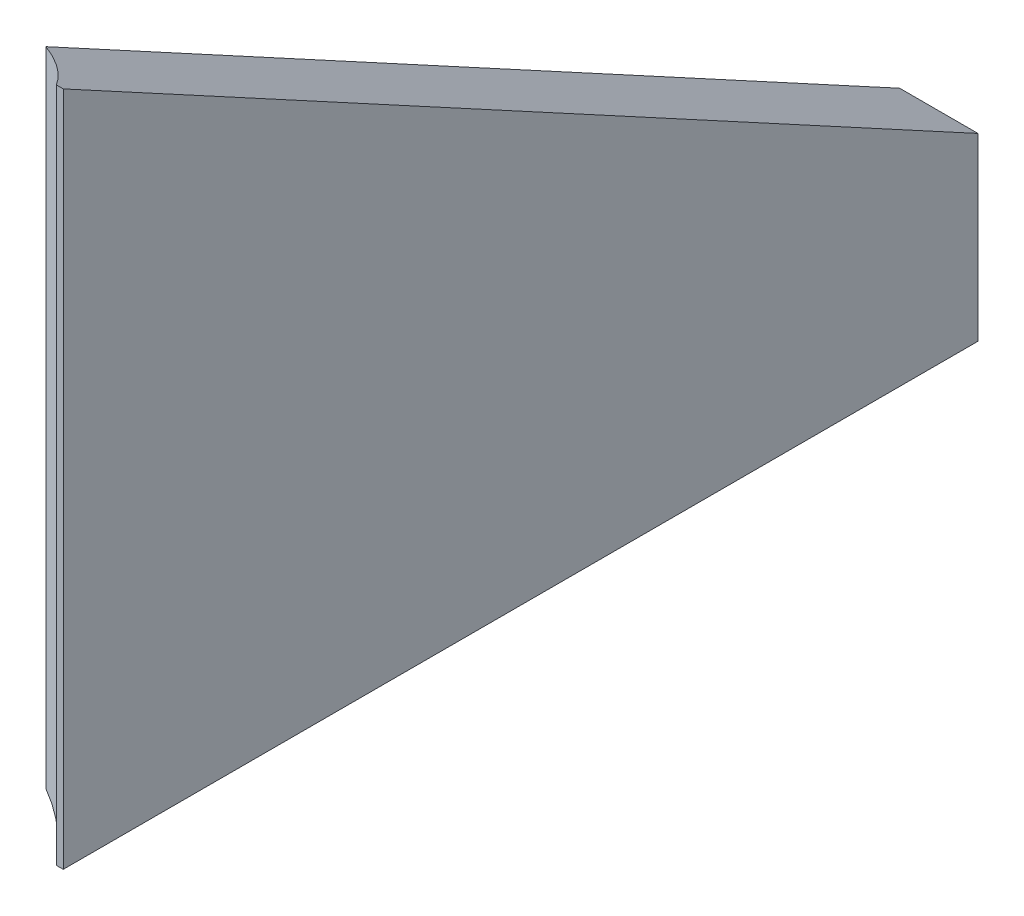
ISO-10303-21;
HEADER;
FILE_DESCRIPTION(('STEP AP214'),'2;1');
FILE_NAME('part.step','',(''),(''),'','','');
FILE_SCHEMA(('AUTOMOTIVE_DESIGN { 1 0 10303 214 1 1 1 1 }'));
ENDSEC;
DATA;
#1=APPLICATION_CONTEXT('core data for automotive mechanical design processes');
#2=APPLICATION_PROTOCOL_DEFINITION('international standard','automotive_design',2000,#1);
#3=PRODUCT_CONTEXT('',#1,'mechanical');
#4=PRODUCT('Part','Part','',(#3));
#5=PRODUCT_RELATED_PRODUCT_CATEGORY('part','',(#4));
#6=PRODUCT_DEFINITION_FORMATION('','',#4);
#7=PRODUCT_DEFINITION_CONTEXT('part definition',#1,'design');
#8=PRODUCT_DEFINITION('design','',#6,#7);
#9=PRODUCT_DEFINITION_SHAPE('','',#8);
#10=(LENGTH_UNIT() NAMED_UNIT(*) SI_UNIT(.MILLI.,.METRE.));
#11=(NAMED_UNIT(*) PLANE_ANGLE_UNIT() SI_UNIT($,.RADIAN.));
#12=(NAMED_UNIT(*) SI_UNIT($,.STERADIAN.) SOLID_ANGLE_UNIT());
#13=UNCERTAINTY_MEASURE_WITH_UNIT(LENGTH_MEASURE(1.E-05),#10,'distance_accuracy_value','');
#14=(GEOMETRIC_REPRESENTATION_CONTEXT(3) GLOBAL_UNCERTAINTY_ASSIGNED_CONTEXT((#13)) GLOBAL_UNIT_ASSIGNED_CONTEXT((#10,
#11,#12)) REPRESENTATION_CONTEXT('',''));
#15=CARTESIAN_POINT('',(0.,0.,0.));
#16=DIRECTION('',(0.,0.,1.));
#17=DIRECTION('',(1.,0.,0.));
#18=AXIS2_PLACEMENT_3D('',#15,#16,#17);
#19=CARTESIAN_POINT('',(3.77,0.,0.));
#20=DIRECTION('',(0.,0.,-1.));
#21=DIRECTION('',(-1.,0.,0.));
#22=AXIS2_PLACEMENT_3D('',#19,#20,#21);
#23=PLANE('',#22);
#24=DIRECTION('',(0.,1.,0.));
#25=VECTOR('',#24,1.);
#26=CARTESIAN_POINT('',(3.43406676279268,-0.0513372813892973,0.));
#27=LINE('',#26,#25);
#28=CARTESIAN_POINT('',(3.43406676279268,0.,0.));
#29=VERTEX_POINT('',#28);
#30=CARTESIAN_POINT('',(3.43406676279291,32.53,0.));
#31=VERTEX_POINT('',#30);
#32=EDGE_CURVE('E75',#29,#31,#27,.T.);
#33=ORIENTED_EDGE('',*,*,#32,.F.);
#34=DIRECTION('',(-1.,0.,0.));
#35=VECTOR('',#34,1.);
#36=CARTESIAN_POINT('',(3.77,0.,0.));
#37=LINE('',#36,#35);
#38=CARTESIAN_POINT('',(3.77,0.,0.));
#39=VERTEX_POINT('',#38);
#40=EDGE_CURVE('E97',#39,#29,#37,.T.);
#41=ORIENTED_EDGE('',*,*,#40,.F.);
#42=DIRECTION('',(0.,-1.,0.));
#43=VECTOR('',#42,1.);
#44=CARTESIAN_POINT('',(3.77,0.,0.));
#45=LINE('',#44,#43);
#46=CARTESIAN_POINT('',(3.77,32.53,0.));
#47=VERTEX_POINT('',#46);
#48=EDGE_CURVE('E101',#47,#39,#45,.T.);
#49=ORIENTED_EDGE('',*,*,#48,.F.);
#50=DIRECTION('',(-1.,0.,0.));
#51=VECTOR('',#50,1.);
#52=CARTESIAN_POINT('',(3.77,32.53,0.));
#53=LINE('',#52,#51);
#54=EDGE_CURVE('E109',#47,#31,#53,.T.);
#55=ORIENTED_EDGE('',*,*,#54,.T.);
#56=EDGE_LOOP('',(#33,#41,#49,#55));
#57=FACE_BOUND('',#56,.T.);
#58=ADVANCED_FACE('F34',(#57),#23,.F.);
#59=CARTESIAN_POINT('',(3.77,0.,0.));
#60=DIRECTION('',(0.,1.,0.));
#61=DIRECTION('',(0.,0.,1.));
#62=AXIS2_PLACEMENT_3D('',#59,#60,#61);
#63=PLANE('',#62);
#64=DIRECTION('',(0.,0.,-1.));
#65=VECTOR('',#64,1.);
#66=CARTESIAN_POINT('',(0.,0.,0.));
#67=LINE('',#66,#65);
#68=CARTESIAN_POINT('',(0.,0.,-2.93908318526129));
#69=VERTEX_POINT('',#68);
#70=CARTESIAN_POINT('',(0.,0.,-44.0246992422334));
#71=VERTEX_POINT('',#70);
#72=EDGE_CURVE('E107',#69,#71,#67,.T.);
#73=ORIENTED_EDGE('',*,*,#72,.T.);
#74=DIRECTION('',(-1.,0.,0.));
#75=VECTOR('',#74,1.);
#76=CARTESIAN_POINT('',(10.,0.,-44.0246992422334));
#77=LINE('',#76,#75);
#78=CARTESIAN_POINT('',(3.77,0.,-44.0246992422334));
#79=VERTEX_POINT('',#78);
#80=EDGE_CURVE('E43',#79,#71,#77,.T.);
#81=ORIENTED_EDGE('',*,*,#80,.F.);
#82=DIRECTION('',(0.,0.,-1.));
#83=VECTOR('',#82,1.);
#84=CARTESIAN_POINT('',(3.77,0.,0.));
#85=LINE('',#84,#83);
#86=EDGE_CURVE('E93',#39,#79,#85,.T.);
#87=ORIENTED_EDGE('',*,*,#86,.F.);
#88=ORIENTED_EDGE('',*,*,#40,.T.);
#89=CARTESIAN_POINT('',(-6.22068336344052,0.,7.805));
#90=DIRECTION('',(0.,1.,0.));
#91=DIRECTION('',(0.,0.,1.));
#92=AXIS2_PLACEMENT_3D('',#89,#90,#91);
#93=CIRCLE('',#92,12.415);
#94=EDGE_CURVE('E67',#69,#29,#93,.F.);
#95=ORIENTED_EDGE('',*,*,#94,.F.);
#96=EDGE_LOOP('',(#73,#81,#87,#88,#95));
#97=FACE_BOUND('',#96,.T.);
#98=ADVANCED_FACE('F95',(#97),#63,.F.);
#99=CARTESIAN_POINT('',(3.77,32.53,0.));
#100=DIRECTION('',(0.,-0.879107819225435,0.476622955990057));
#101=DIRECTION('',(0.,-0.476622955990057,-0.879107819225435));
#102=AXIS2_PLACEMENT_3D('',#99,#100,#101);
#103=PLANE('',#102);
#104=DIRECTION('',(0.,0.476622955990057,0.879107819225435));
#105=VECTOR('',#104,1.);
#106=CARTESIAN_POINT('',(3.77,32.53,0.));
#107=LINE('',#106,#105);
#108=CARTESIAN_POINT('',(3.77,8.66127556083579,-44.0246992422334));
#109=VERTEX_POINT('',#108);
#110=EDGE_CURVE('E82',#109,#47,#107,.T.);
#111=ORIENTED_EDGE('',*,*,#110,.F.);
#112=DIRECTION('',(-1.,0.,0.));
#113=VECTOR('',#112,1.);
#114=CARTESIAN_POINT('',(10.,8.66127556083579,-44.0246992422334));
#115=LINE('',#114,#113);
#116=CARTESIAN_POINT('',(0.,8.66127556083579,-44.0246992422334));
#117=VERTEX_POINT('',#116);
#118=EDGE_CURVE('E106',#109,#117,#115,.T.);
#119=ORIENTED_EDGE('',*,*,#118,.T.);
#120=DIRECTION('',(0.,0.476622955990057,0.879107819225435));
#121=VECTOR('',#120,1.);
#122=CARTESIAN_POINT('',(0.,32.53,0.));
#123=LINE('',#122,#121);
#124=CARTESIAN_POINT('',(1.08193550100877E-13,30.9365270663908,-2.93908318526129));
#125=VERTEX_POINT('',#124);
#126=EDGE_CURVE('E88',#117,#125,#123,.T.);
#127=ORIENTED_EDGE('',*,*,#126,.T.);
#128=CARTESIAN_POINT('',(-6.22068336344026,36.7616108333333,7.805));
#129=DIRECTION('',(0.,-0.879107819225435,0.476622955990057));
#130=DIRECTION('',(0.,0.476622955990057,0.879107819225435));
#131=AXIS2_PLACEMENT_3D('',#128,#129,#130);
#132=ELLIPSE('',#131,14.1222722952671,12.415);
#133=EDGE_CURVE('E118',#31,#125,#132,.F.);
#134=ORIENTED_EDGE('',*,*,#133,.F.);
#135=ORIENTED_EDGE('',*,*,#54,.F.);
#136=EDGE_LOOP('',(#111,#119,#127,#134,#135));
#137=FACE_BOUND('',#136,.T.);
#138=ADVANCED_FACE('F126',(#137),#103,.F.);
#139=CARTESIAN_POINT('',(0.,0.,0.));
#140=DIRECTION('',(-1.,0.,0.));
#141=DIRECTION('',(0.,0.,1.));
#142=AXIS2_PLACEMENT_3D('',#139,#140,#141);
#143=PLANE('',#142);
#144=DIRECTION('',(0.,1.,0.));
#145=VECTOR('',#144,1.);
#146=CARTESIAN_POINT('',(0.,0.,-44.0246992422334));
#147=LINE('',#146,#145);
#148=EDGE_CURVE('E11',#71,#117,#147,.T.);
#149=ORIENTED_EDGE('',*,*,#148,.F.);
#150=ORIENTED_EDGE('',*,*,#72,.F.);
#151=DIRECTION('',(0.,1.,0.));
#152=VECTOR('',#151,1.);
#153=CARTESIAN_POINT('',(0.,-0.0513372813892299,-2.93908318526129));
#154=LINE('',#153,#152);
#155=EDGE_CURVE('E98',#69,#125,#154,.T.);
#156=ORIENTED_EDGE('',*,*,#155,.T.);
#157=ORIENTED_EDGE('',*,*,#126,.F.);
#158=EDGE_LOOP('',(#149,#150,#156,#157));
#159=FACE_BOUND('',#158,.T.);
#160=ADVANCED_FACE('F36',(#159),#143,.T.);
#161=CARTESIAN_POINT('',(3.77,0.,0.));
#162=DIRECTION('',(-1.,0.,0.));
#163=DIRECTION('',(0.,0.,1.));
#164=AXIS2_PLACEMENT_3D('',#161,#162,#163);
#165=PLANE('',#164);
#166=ORIENTED_EDGE('',*,*,#86,.T.);
#167=DIRECTION('',(0.,1.,0.));
#168=VECTOR('',#167,1.);
#169=CARTESIAN_POINT('',(3.77,0.,-44.0246992422334));
#170=LINE('',#169,#168);
#171=EDGE_CURVE('E51',#79,#109,#170,.T.);
#172=ORIENTED_EDGE('',*,*,#171,.T.);
#173=ORIENTED_EDGE('',*,*,#110,.T.);
#174=ORIENTED_EDGE('',*,*,#48,.T.);
#175=EDGE_LOOP('',(#166,#172,#173,#174));
#176=FACE_BOUND('',#175,.T.);
#177=ADVANCED_FACE('F102',(#176),#165,.F.);
#178=CARTESIAN_POINT('',(-6.22068336344052,-0.0513372813892299,7.805));
#179=DIRECTION('',(0.,1.,0.));
#180=DIRECTION('',(0.,0.,-1.));
#181=AXIS2_PLACEMENT_3D('',#178,#179,#180);
#182=CYLINDRICAL_SURFACE('',#181,12.415);
#183=ORIENTED_EDGE('',*,*,#32,.T.);
#184=ORIENTED_EDGE('',*,*,#133,.T.);
#185=ORIENTED_EDGE('',*,*,#155,.F.);
#186=ORIENTED_EDGE('',*,*,#94,.T.);
#187=EDGE_LOOP('',(#183,#184,#185,#186));
#188=FACE_BOUND('',#187,.T.);
#189=ADVANCED_FACE('F122',(#188),#182,.F.);
#190=CARTESIAN_POINT('',(10.,0.,-44.0246992422334));
#191=DIRECTION('',(0.,0.,1.));
#192=DIRECTION('',(1.,0.,0.));
#193=AXIS2_PLACEMENT_3D('',#190,#191,#192);
#194=PLANE('',#193);
#195=ORIENTED_EDGE('',*,*,#80,.T.);
#196=ORIENTED_EDGE('',*,*,#148,.T.);
#197=ORIENTED_EDGE('',*,*,#118,.F.);
#198=ORIENTED_EDGE('',*,*,#171,.F.);
#199=EDGE_LOOP('',(#195,#196,#197,#198));
#200=FACE_BOUND('',#199,.T.);
#201=ADVANCED_FACE('F141',(#200),#194,.F.);
#202=CLOSED_SHELL('',(#58,#98,#138,#160,#177,#189,#201));
#203=MANIFOLD_SOLID_BREP('B2',#202);
#204=ADVANCED_BREP_SHAPE_REPRESENTATION('',(#18,#203),#14);
#205=SHAPE_DEFINITION_REPRESENTATION(#9,#204);
ENDSEC;
END-ISO-10303-21;
